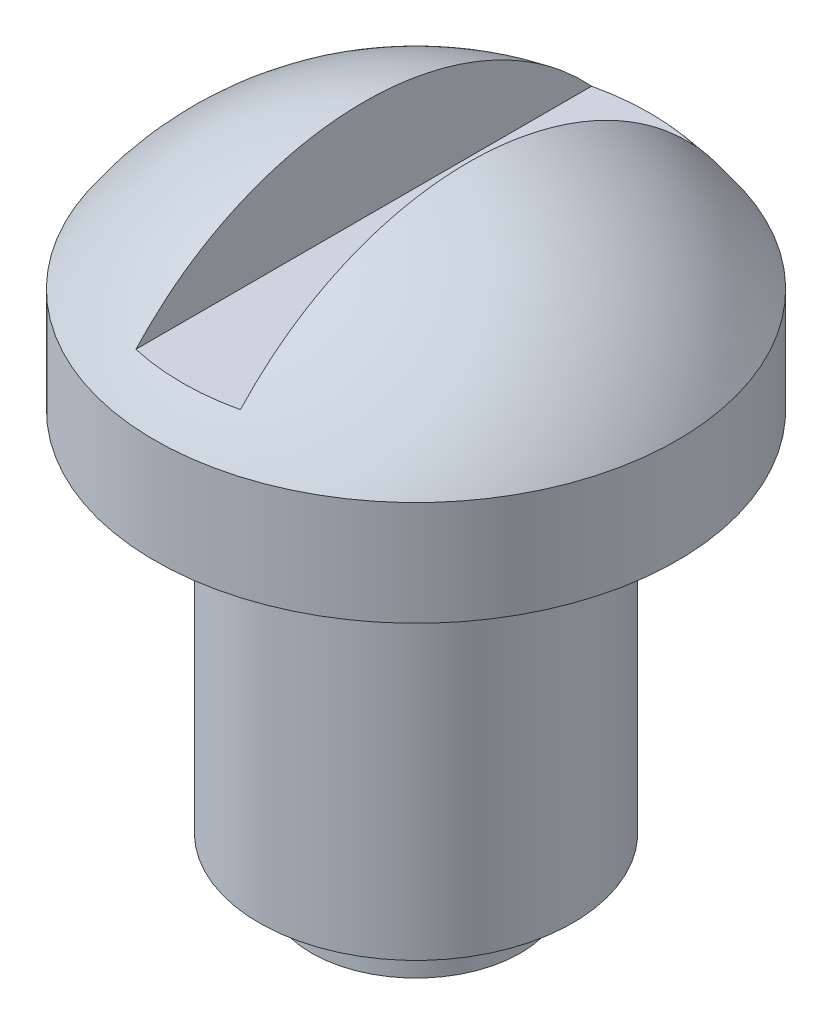
ISO-10303-21;
HEADER;
FILE_DESCRIPTION(('STEP AP214'),'2;1');
FILE_NAME('part.step','',(''),(''),'','','');
FILE_SCHEMA(('AUTOMOTIVE_DESIGN { 1 0 10303 214 1 1 1 1 }'));
ENDSEC;
DATA;
#1=APPLICATION_CONTEXT('core data for automotive mechanical design processes');
#2=APPLICATION_PROTOCOL_DEFINITION('international standard','automotive_design',2000,#1);
#3=PRODUCT_CONTEXT('',#1,'mechanical');
#4=PRODUCT('Part','Part','',(#3));
#5=PRODUCT_RELATED_PRODUCT_CATEGORY('part','',(#4));
#6=PRODUCT_DEFINITION_FORMATION('','',#4);
#7=PRODUCT_DEFINITION_CONTEXT('part definition',#1,'design');
#8=PRODUCT_DEFINITION('design','',#6,#7);
#9=PRODUCT_DEFINITION_SHAPE('','',#8);
#10=(LENGTH_UNIT() NAMED_UNIT(*) SI_UNIT(.MILLI.,.METRE.));
#11=(NAMED_UNIT(*) PLANE_ANGLE_UNIT() SI_UNIT($,.RADIAN.));
#12=(NAMED_UNIT(*) SI_UNIT($,.STERADIAN.) SOLID_ANGLE_UNIT());
#13=UNCERTAINTY_MEASURE_WITH_UNIT(LENGTH_MEASURE(1.E-05),#10,'distance_accuracy_value','');
#14=(GEOMETRIC_REPRESENTATION_CONTEXT(3) GLOBAL_UNCERTAINTY_ASSIGNED_CONTEXT((#13)) GLOBAL_UNIT_ASSIGNED_CONTEXT((#10,
#11,#12)) REPRESENTATION_CONTEXT('',''));
#15=CARTESIAN_POINT('',(0.,0.,0.));
#16=DIRECTION('',(0.,0.,1.));
#17=DIRECTION('',(1.,0.,0.));
#18=AXIS2_PLACEMENT_3D('',#15,#16,#17);
#19=CARTESIAN_POINT('',(0.,-6.,0.));
#20=DIRECTION('',(0.,1.,0.));
#21=DIRECTION('',(1.,0.,0.));
#22=AXIS2_PLACEMENT_3D('',#19,#20,#21);
#23=SPHERICAL_SURFACE('',#22,6.);
#24=CARTESIAN_POINT('',(0.,-2.,0.));
#25=DIRECTION('',(0.,-1.,0.));
#26=DIRECTION('',(0.,0.,-1.));
#27=AXIS2_PLACEMENT_3D('',#24,#25,#26);
#28=CIRCLE('',#27,4.47213595499958);
#29=CARTESIAN_POINT('',(-1.,-2.,-4.35889894354067));
#30=VERTEX_POINT('',#29);
#31=CARTESIAN_POINT('',(1.,-2.,-4.35889894354067));
#32=VERTEX_POINT('',#31);
#33=EDGE_CURVE('E75',#30,#32,#28,.T.);
#34=ORIENTED_EDGE('',*,*,#33,.T.);
#35=CARTESIAN_POINT('',(1.,-6.,0.));
#36=DIRECTION('',(1.,0.,0.));
#37=DIRECTION('',(0.,0.,-1.));
#38=AXIS2_PLACEMENT_3D('',#35,#36,#37);
#39=CIRCLE('',#38,5.91607978309962);
#40=CARTESIAN_POINT('',(1.,-2.,4.35889894354067));
#41=VERTEX_POINT('',#40);
#42=EDGE_CURVE('E11',#32,#41,#39,.T.);
#43=ORIENTED_EDGE('',*,*,#42,.T.);
#44=CARTESIAN_POINT('',(-1.,-2.,4.35889894354067));
#45=VERTEX_POINT('',#44);
#46=EDGE_CURVE('E51',#41,#45,#28,.T.);
#47=ORIENTED_EDGE('',*,*,#46,.T.);
#48=CARTESIAN_POINT('',(-1.,-6.,0.));
#49=DIRECTION('',(-1.,0.,0.));
#50=DIRECTION('',(0.,-1.,0.));
#51=AXIS2_PLACEMENT_3D('',#48,#49,#50);
#52=CIRCLE('',#51,5.91607978309962);
#53=EDGE_CURVE('E70',#45,#30,#52,.T.);
#54=ORIENTED_EDGE('',*,*,#53,.T.);
#55=EDGE_LOOP('',(#34,#43,#47,#54));
#56=FACE_BOUND('',#55,.T.);
#57=CARTESIAN_POINT('',(0.,-2.6833752096446,0.));
#58=DIRECTION('',(0.,1.,0.));
#59=DIRECTION('',(-1.,0.,0.));
#60=AXIS2_PLACEMENT_3D('',#57,#58,#59);
#61=CIRCLE('',#60,5.);
#62=CARTESIAN_POINT('',(-5.,-2.6833752096446,0.));
#63=VERTEX_POINT('',#62);
#64=EDGE_CURVE('E76',#63,#63,#61,.T.);
#65=ORIENTED_EDGE('',*,*,#64,.T.);
#66=EDGE_LOOP('',(#65));
#67=FACE_BOUND('',#66,.T.);
#68=ADVANCED_FACE('F43',(#56,#67),#23,.T.);
#69=CARTESIAN_POINT('',(0.,0.,0.));
#70=DIRECTION('',(0.,1.,0.));
#71=DIRECTION('',(-1.,0.,0.));
#72=AXIS2_PLACEMENT_3D('',#69,#70,#71);
#73=CYLINDRICAL_SURFACE('',#72,5.);
#74=ORIENTED_EDGE('',*,*,#64,.F.);
#75=EDGE_LOOP('',(#74));
#76=FACE_BOUND('',#75,.T.);
#77=CARTESIAN_POINT('',(0.,-4.6833752096446,0.));
#78=DIRECTION('',(0.,1.,0.));
#79=DIRECTION('',(-1.,0.,0.));
#80=AXIS2_PLACEMENT_3D('',#77,#78,#79);
#81=CIRCLE('',#80,5.);
#82=CARTESIAN_POINT('',(-5.,-4.6833752096446,0.));
#83=VERTEX_POINT('',#82);
#84=EDGE_CURVE('E89',#83,#83,#81,.T.);
#85=ORIENTED_EDGE('',*,*,#84,.T.);
#86=EDGE_LOOP('',(#85));
#87=FACE_BOUND('',#86,.T.);
#88=ADVANCED_FACE('F125',(#76,#87),#73,.T.);
#89=CARTESIAN_POINT('',(3.,-4.6833752096446,0.));
#90=DIRECTION('',(0.,1.,0.));
#91=DIRECTION('',(-1.,0.,0.));
#92=AXIS2_PLACEMENT_3D('',#89,#90,#91);
#93=PLANE('',#92);
#94=ORIENTED_EDGE('',*,*,#84,.F.);
#95=EDGE_LOOP('',(#94));
#96=FACE_BOUND('',#95,.T.);
#97=CARTESIAN_POINT('',(0.,-4.6833752096446,0.));
#98=DIRECTION('',(0.,1.,0.));
#99=DIRECTION('',(-1.,0.,0.));
#100=AXIS2_PLACEMENT_3D('',#97,#98,#99);
#101=CIRCLE('',#100,3.);
#102=CARTESIAN_POINT('',(-3.,-4.6833752096446,0.));
#103=VERTEX_POINT('',#102);
#104=EDGE_CURVE('E93',#103,#103,#101,.T.);
#105=ORIENTED_EDGE('',*,*,#104,.T.);
#106=EDGE_LOOP('',(#105));
#107=FACE_BOUND('',#106,.T.);
#108=ADVANCED_FACE('F129',(#96,#107),#93,.F.);
#109=CARTESIAN_POINT('',(0.,0.,0.));
#110=DIRECTION('',(0.,1.,0.));
#111=DIRECTION('',(-1.,0.,0.));
#112=AXIS2_PLACEMENT_3D('',#109,#110,#111);
#113=CYLINDRICAL_SURFACE('',#112,3.);
#114=ORIENTED_EDGE('',*,*,#104,.F.);
#115=EDGE_LOOP('',(#114));
#116=FACE_BOUND('',#115,.T.);
#117=CARTESIAN_POINT('',(0.,-11.6833752096446,0.));
#118=DIRECTION('',(0.,1.,0.));
#119=DIRECTION('',(-1.,0.,0.));
#120=AXIS2_PLACEMENT_3D('',#117,#118,#119);
#121=CIRCLE('',#120,3.);
#122=CARTESIAN_POINT('',(-3.,-11.6833752096446,0.));
#123=VERTEX_POINT('',#122);
#124=EDGE_CURVE('E97',#123,#123,#121,.T.);
#125=ORIENTED_EDGE('',*,*,#124,.T.);
#126=EDGE_LOOP('',(#125));
#127=FACE_BOUND('',#126,.T.);
#128=ADVANCED_FACE('F134',(#116,#127),#113,.T.);
#129=CARTESIAN_POINT('',(2.,-11.6833752096446,0.));
#130=DIRECTION('',(0.,1.,0.));
#131=DIRECTION('',(-1.,0.,0.));
#132=AXIS2_PLACEMENT_3D('',#129,#130,#131);
#133=PLANE('',#132);
#134=ORIENTED_EDGE('',*,*,#124,.F.);
#135=EDGE_LOOP('',(#134));
#136=FACE_BOUND('',#135,.T.);
#137=CARTESIAN_POINT('',(0.,-11.6833752096446,0.));
#138=DIRECTION('',(0.,1.,0.));
#139=DIRECTION('',(-1.,0.,0.));
#140=AXIS2_PLACEMENT_3D('',#137,#138,#139);
#141=CIRCLE('',#140,2.);
#142=CARTESIAN_POINT('',(-2.,-11.6833752096446,0.));
#143=VERTEX_POINT('',#142);
#144=EDGE_CURVE('E101',#143,#143,#141,.T.);
#145=ORIENTED_EDGE('',*,*,#144,.T.);
#146=EDGE_LOOP('',(#145));
#147=FACE_BOUND('',#146,.T.);
#148=ADVANCED_FACE('F142',(#136,#147),#133,.F.);
#149=CARTESIAN_POINT('',(0.,0.,0.));
#150=DIRECTION('',(0.,1.,0.));
#151=DIRECTION('',(-1.,0.,0.));
#152=AXIS2_PLACEMENT_3D('',#149,#150,#151);
#153=CYLINDRICAL_SURFACE('',#152,2.);
#154=ORIENTED_EDGE('',*,*,#144,.F.);
#155=EDGE_LOOP('',(#154));
#156=FACE_BOUND('',#155,.T.);
#157=CARTESIAN_POINT('',(0.,-12.6833752096446,0.));
#158=DIRECTION('',(0.,1.,0.));
#159=DIRECTION('',(-1.,0.,0.));
#160=AXIS2_PLACEMENT_3D('',#157,#158,#159);
#161=CIRCLE('',#160,2.);
#162=CARTESIAN_POINT('',(-2.,-12.6833752096446,0.));
#163=VERTEX_POINT('',#162);
#164=EDGE_CURVE('E105',#163,#163,#161,.T.);
#165=ORIENTED_EDGE('',*,*,#164,.T.);
#166=EDGE_LOOP('',(#165));
#167=FACE_BOUND('',#166,.T.);
#168=ADVANCED_FACE('F120',(#156,#167),#153,.T.);
#169=CARTESIAN_POINT('',(0.,-12.6833752096446,0.));
#170=DIRECTION('',(0.,1.,0.));
#171=DIRECTION('',(-1.,0.,0.));
#172=AXIS2_PLACEMENT_3D('',#169,#170,#171);
#173=PLANE('',#172);
#174=ORIENTED_EDGE('',*,*,#164,.F.);
#175=EDGE_LOOP('',(#174));
#176=FACE_BOUND('',#175,.T.);
#177=ADVANCED_FACE('F113',(#176),#173,.F.);
#178=CARTESIAN_POINT('',(1.,2.,-5.));
#179=DIRECTION('',(1.,0.,0.));
#180=DIRECTION('',(0.,0.,-1.));
#181=AXIS2_PLACEMENT_3D('',#178,#179,#180);
#182=PLANE('',#181);
#183=DIRECTION('',(0.,0.,1.));
#184=VECTOR('',#183,1.);
#185=CARTESIAN_POINT('',(1.,-2.,-5.));
#186=LINE('',#185,#184);
#187=EDGE_CURVE('E80',#32,#41,#186,.T.);
#188=ORIENTED_EDGE('',*,*,#187,.T.);
#189=ORIENTED_EDGE('',*,*,#42,.F.);
#190=EDGE_LOOP('',(#188,#189));
#191=FACE_BOUND('',#190,.T.);
#192=ADVANCED_FACE('F111',(#191),#182,.F.);
#193=CARTESIAN_POINT('',(-1.,-2.,-5.));
#194=DIRECTION('',(0.,-1.,0.));
#195=DIRECTION('',(0.,0.,-1.));
#196=AXIS2_PLACEMENT_3D('',#193,#194,#195);
#197=PLANE('',#196);
#198=ORIENTED_EDGE('',*,*,#187,.F.);
#199=ORIENTED_EDGE('',*,*,#33,.F.);
#200=DIRECTION('',(0.,0.,1.));
#201=VECTOR('',#200,1.);
#202=CARTESIAN_POINT('',(-1.,-2.,-5.));
#203=LINE('',#202,#201);
#204=EDGE_CURVE('E57',#30,#45,#203,.T.);
#205=ORIENTED_EDGE('',*,*,#204,.T.);
#206=ORIENTED_EDGE('',*,*,#46,.F.);
#207=EDGE_LOOP('',(#198,#199,#205,#206));
#208=FACE_BOUND('',#207,.T.);
#209=ADVANCED_FACE('F78',(#208),#197,.F.);
#210=CARTESIAN_POINT('',(-0.999999999999999,2.,-5.));
#211=DIRECTION('',(-1.,0.,0.));
#212=DIRECTION('',(0.,-1.,0.));
#213=AXIS2_PLACEMENT_3D('',#210,#211,#212);
#214=PLANE('',#213);
#215=ORIENTED_EDGE('',*,*,#204,.F.);
#216=ORIENTED_EDGE('',*,*,#53,.F.);
#217=EDGE_LOOP('',(#215,#216));
#218=FACE_BOUND('',#217,.T.);
#219=ADVANCED_FACE('F71',(#218),#214,.F.);
#220=CLOSED_SHELL('',(#68,#88,#108,#128,#148,#168,#177,#192,#209,#219));
#221=MANIFOLD_SOLID_BREP('B2',#220);
#222=ADVANCED_BREP_SHAPE_REPRESENTATION('',(#18,#221),#14);
#223=SHAPE_DEFINITION_REPRESENTATION(#9,#222);
ENDSEC;
END-ISO-10303-21;
